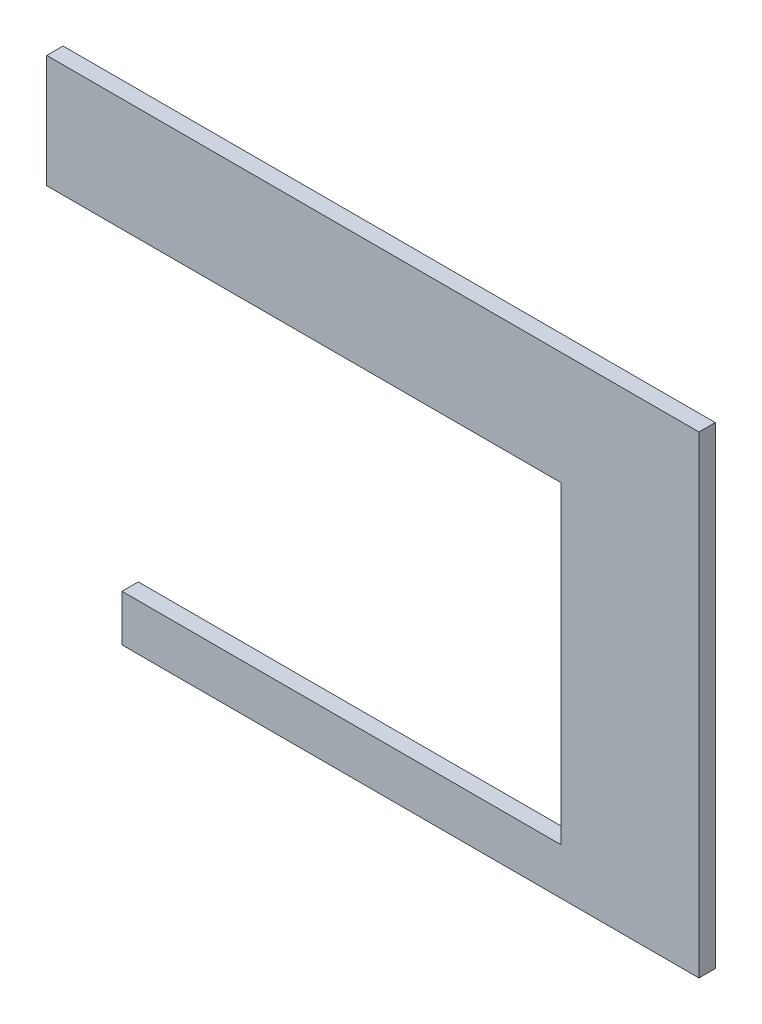
ISO-10303-21;
HEADER;
FILE_DESCRIPTION(('STEP AP214'),'2;1');
FILE_NAME('part.step','',(''),(''),'','','');
FILE_SCHEMA(('AUTOMOTIVE_DESIGN { 1 0 10303 214 1 1 1 1 }'));
ENDSEC;
DATA;
#1=APPLICATION_CONTEXT('core data for automotive mechanical design processes');
#2=APPLICATION_PROTOCOL_DEFINITION('international standard','automotive_design',2000,#1);
#3=PRODUCT_CONTEXT('',#1,'mechanical');
#4=PRODUCT('Part','Part','',(#3));
#5=PRODUCT_RELATED_PRODUCT_CATEGORY('part','',(#4));
#6=PRODUCT_DEFINITION_FORMATION('','',#4);
#7=PRODUCT_DEFINITION_CONTEXT('part definition',#1,'design');
#8=PRODUCT_DEFINITION('design','',#6,#7);
#9=PRODUCT_DEFINITION_SHAPE('','',#8);
#10=(LENGTH_UNIT() NAMED_UNIT(*) SI_UNIT(.MILLI.,.METRE.));
#11=(NAMED_UNIT(*) PLANE_ANGLE_UNIT() SI_UNIT($,.RADIAN.));
#12=(NAMED_UNIT(*) SI_UNIT($,.STERADIAN.) SOLID_ANGLE_UNIT());
#13=UNCERTAINTY_MEASURE_WITH_UNIT(LENGTH_MEASURE(1.E-05),#10,'distance_accuracy_value','');
#14=(GEOMETRIC_REPRESENTATION_CONTEXT(3) GLOBAL_UNCERTAINTY_ASSIGNED_CONTEXT((#13)) GLOBAL_UNIT_ASSIGNED_CONTEXT((#10,
#11,#12)) REPRESENTATION_CONTEXT('',''));
#15=CARTESIAN_POINT('',(0.,0.,0.));
#16=DIRECTION('',(0.,0.,1.));
#17=DIRECTION('',(1.,0.,0.));
#18=AXIS2_PLACEMENT_3D('',#15,#16,#17);
#19=CARTESIAN_POINT('',(9.23076923076924,-15.,0.5));
#20=DIRECTION('',(-1.,0.,0.));
#21=DIRECTION('',(0.,0.,1.));
#22=AXIS2_PLACEMENT_3D('',#19,#20,#21);
#23=PLANE('',#22);
#24=DIRECTION('',(0.,1.,0.));
#25=VECTOR('',#24,1.);
#26=CARTESIAN_POINT('',(9.23076923076924,-15.,0.5));
#27=LINE('',#26,#25);
#28=CARTESIAN_POINT('',(9.23076923076924,0.5,0.5));
#29=VERTEX_POINT('',#28);
#30=CARTESIAN_POINT('',(9.23076923076924,15.,0.5));
#31=VERTEX_POINT('',#30);
#32=EDGE_CURVE('E120',#29,#31,#27,.T.);
#33=ORIENTED_EDGE('',*,*,#32,.F.);
#34=DIRECTION('',(0.,0.,-1.));
#35=VECTOR('',#34,1.);
#36=CARTESIAN_POINT('',(9.23076923076924,0.5,0.5));
#37=LINE('',#36,#35);
#38=CARTESIAN_POINT('',(9.23076923076924,0.5,0.));
#39=VERTEX_POINT('',#38);
#40=EDGE_CURVE('E53',#29,#39,#37,.T.);
#41=ORIENTED_EDGE('',*,*,#40,.T.);
#42=DIRECTION('',(0.,1.,0.));
#43=VECTOR('',#42,1.);
#44=CARTESIAN_POINT('',(9.23076923076924,-15.,0.));
#45=LINE('',#44,#43);
#46=CARTESIAN_POINT('',(9.23076923076924,15.,0.));
#47=VERTEX_POINT('',#46);
#48=EDGE_CURVE('E115',#39,#47,#45,.T.);
#49=ORIENTED_EDGE('',*,*,#48,.T.);
#50=DIRECTION('',(0.,0.,-1.));
#51=VECTOR('',#50,1.);
#52=CARTESIAN_POINT('',(9.23076923076924,15.,0.5));
#53=LINE('',#52,#51);
#54=EDGE_CURVE('E140',#31,#47,#53,.T.);
#55=ORIENTED_EDGE('',*,*,#54,.F.);
#56=EDGE_LOOP('',(#33,#41,#49,#55));
#57=FACE_BOUND('',#56,.T.);
#58=ADVANCED_FACE('F39',(#57),#23,.F.);
#59=CARTESIAN_POINT('',(-8.46153846153845,1.92307692307692,0.5));
#60=DIRECTION('',(1.,0.,0.));
#61=DIRECTION('',(0.,0.,-1.));
#62=AXIS2_PLACEMENT_3D('',#59,#60,#61);
#63=PLANE('',#62);
#64=DIRECTION('',(0.,-1.,0.));
#65=VECTOR('',#64,1.);
#66=CARTESIAN_POINT('',(-8.46153846153845,1.92307692307692,0.));
#67=LINE('',#66,#65);
#68=CARTESIAN_POINT('',(-8.46153846153845,1.92307692307692,0.));
#69=VERTEX_POINT('',#68);
#70=CARTESIAN_POINT('',(-8.46153846153845,0.5,0.));
#71=VERTEX_POINT('',#70);
#72=EDGE_CURVE('E103',#69,#71,#67,.T.);
#73=ORIENTED_EDGE('',*,*,#72,.T.);
#74=DIRECTION('',(0.,0.,1.));
#75=VECTOR('',#74,1.);
#76=CARTESIAN_POINT('',(-8.46153846153845,0.5,0.5));
#77=LINE('',#76,#75);
#78=CARTESIAN_POINT('',(-8.46153846153845,0.5,0.5));
#79=VERTEX_POINT('',#78);
#80=EDGE_CURVE('E100',#71,#79,#77,.T.);
#81=ORIENTED_EDGE('',*,*,#80,.T.);
#82=DIRECTION('',(0.,-1.,0.));
#83=VECTOR('',#82,1.);
#84=CARTESIAN_POINT('',(-8.46153846153845,1.92307692307692,0.5));
#85=LINE('',#84,#83);
#86=CARTESIAN_POINT('',(-8.46153846153845,1.92307692307692,0.5));
#87=VERTEX_POINT('',#86);
#88=EDGE_CURVE('E123',#87,#79,#85,.T.);
#89=ORIENTED_EDGE('',*,*,#88,.F.);
#90=DIRECTION('',(0.,0.,-1.));
#91=VECTOR('',#90,1.);
#92=CARTESIAN_POINT('',(-8.46153846153845,1.92307692307692,0.5));
#93=LINE('',#92,#91);
#94=EDGE_CURVE('E101',#87,#69,#93,.T.);
#95=ORIENTED_EDGE('',*,*,#94,.T.);
#96=EDGE_LOOP('',(#73,#81,#89,#95));
#97=FACE_BOUND('',#96,.T.);
#98=ADVANCED_FACE('F114',(#97),#63,.F.);
#99=CARTESIAN_POINT('',(0.,0.,0.5));
#100=DIRECTION('',(0.,0.,1.));
#101=DIRECTION('',(1.,0.,0.));
#102=AXIS2_PLACEMENT_3D('',#99,#100,#101);
#103=PLANE('',#102);
#104=DIRECTION('',(-1.,0.,0.));
#105=VECTOR('',#104,1.);
#106=CARTESIAN_POINT('',(0.,0.5,0.5));
#107=LINE('',#106,#105);
#108=EDGE_CURVE('E48',#29,#79,#107,.T.);
#109=ORIENTED_EDGE('',*,*,#108,.F.);
#110=ORIENTED_EDGE('',*,*,#32,.T.);
#111=DIRECTION('',(-1.,0.,0.));
#112=VECTOR('',#111,1.);
#113=CARTESIAN_POINT('',(9.23076923076924,15.,0.5));
#114=LINE('',#113,#112);
#115=CARTESIAN_POINT('',(-10.7692307692308,15.,0.5));
#116=VERTEX_POINT('',#115);
#117=EDGE_CURVE('E118',#31,#116,#114,.T.);
#118=ORIENTED_EDGE('',*,*,#117,.T.);
#119=DIRECTION('',(0.,-1.,0.));
#120=VECTOR('',#119,1.);
#121=CARTESIAN_POINT('',(-10.7692307692308,15.,0.5));
#122=LINE('',#121,#120);
#123=CARTESIAN_POINT('',(-10.7692307692308,11.5384615384615,0.5));
#124=VERTEX_POINT('',#123);
#125=EDGE_CURVE('E129',#116,#124,#122,.T.);
#126=ORIENTED_EDGE('',*,*,#125,.T.);
#127=DIRECTION('',(1.,0.,0.));
#128=VECTOR('',#127,1.);
#129=CARTESIAN_POINT('',(-10.7692307692308,11.5384615384615,0.5));
#130=LINE('',#129,#128);
#131=CARTESIAN_POINT('',(5.00000000000001,11.5384615384615,0.5));
#132=VERTEX_POINT('',#131);
#133=EDGE_CURVE('E131',#124,#132,#130,.T.);
#134=ORIENTED_EDGE('',*,*,#133,.T.);
#135=DIRECTION('',(0.,-1.,0.));
#136=VECTOR('',#135,1.);
#137=CARTESIAN_POINT('',(5.00000000000001,11.5384615384615,0.5));
#138=LINE('',#137,#136);
#139=CARTESIAN_POINT('',(5.00000000000001,1.92307692307692,0.5));
#140=VERTEX_POINT('',#139);
#141=EDGE_CURVE('E133',#132,#140,#138,.T.);
#142=ORIENTED_EDGE('',*,*,#141,.T.);
#143=DIRECTION('',(-1.,0.,0.));
#144=VECTOR('',#143,1.);
#145=CARTESIAN_POINT('',(5.00000000000001,1.92307692307692,0.5));
#146=LINE('',#145,#144);
#147=EDGE_CURVE('E125',#140,#87,#146,.T.);
#148=ORIENTED_EDGE('',*,*,#147,.T.);
#149=ORIENTED_EDGE('',*,*,#88,.T.);
#150=EDGE_LOOP('',(#109,#110,#118,#126,#134,#142,#148,#149));
#151=FACE_BOUND('',#150,.T.);
#152=ADVANCED_FACE('F177',(#151),#103,.T.);
#153=CARTESIAN_POINT('',(0.,0.,0.));
#154=DIRECTION('',(0.,0.,1.));
#155=DIRECTION('',(1.,0.,0.));
#156=AXIS2_PLACEMENT_3D('',#153,#154,#155);
#157=PLANE('',#156);
#158=DIRECTION('',(1.,0.,0.));
#159=VECTOR('',#158,1.);
#160=CARTESIAN_POINT('',(-17.,0.5,0.));
#161=LINE('',#160,#159);
#162=EDGE_CURVE('E11',#71,#39,#161,.T.);
#163=ORIENTED_EDGE('',*,*,#162,.F.);
#164=ORIENTED_EDGE('',*,*,#72,.F.);
#165=DIRECTION('',(-1.,0.,0.));
#166=VECTOR('',#165,1.);
#167=CARTESIAN_POINT('',(5.00000000000001,1.92307692307692,0.));
#168=LINE('',#167,#166);
#169=CARTESIAN_POINT('',(5.00000000000001,1.92307692307692,0.));
#170=VERTEX_POINT('',#169);
#171=EDGE_CURVE('E150',#170,#69,#168,.T.);
#172=ORIENTED_EDGE('',*,*,#171,.F.);
#173=DIRECTION('',(0.,-1.,0.));
#174=VECTOR('',#173,1.);
#175=CARTESIAN_POINT('',(5.00000000000001,11.5384615384615,0.));
#176=LINE('',#175,#174);
#177=CARTESIAN_POINT('',(5.00000000000001,11.5384615384615,0.));
#178=VERTEX_POINT('',#177);
#179=EDGE_CURVE('E143',#178,#170,#176,.T.);
#180=ORIENTED_EDGE('',*,*,#179,.F.);
#181=DIRECTION('',(1.,0.,0.));
#182=VECTOR('',#181,1.);
#183=CARTESIAN_POINT('',(-10.7692307692308,11.5384615384615,0.));
#184=LINE('',#183,#182);
#185=CARTESIAN_POINT('',(-10.7692307692308,11.5384615384615,0.));
#186=VERTEX_POINT('',#185);
#187=EDGE_CURVE('E141',#186,#178,#184,.T.);
#188=ORIENTED_EDGE('',*,*,#187,.F.);
#189=DIRECTION('',(0.,-1.,0.));
#190=VECTOR('',#189,1.);
#191=CARTESIAN_POINT('',(-10.7692307692308,15.,0.));
#192=LINE('',#191,#190);
#193=CARTESIAN_POINT('',(-10.7692307692308,15.,0.));
#194=VERTEX_POINT('',#193);
#195=EDGE_CURVE('E138',#194,#186,#192,.T.);
#196=ORIENTED_EDGE('',*,*,#195,.F.);
#197=DIRECTION('',(-1.,0.,0.));
#198=VECTOR('',#197,1.);
#199=CARTESIAN_POINT('',(9.23076923076924,15.,0.));
#200=LINE('',#199,#198);
#201=EDGE_CURVE('E121',#47,#194,#200,.T.);
#202=ORIENTED_EDGE('',*,*,#201,.F.);
#203=ORIENTED_EDGE('',*,*,#48,.F.);
#204=EDGE_LOOP('',(#163,#164,#172,#180,#188,#196,#202,#203));
#205=FACE_BOUND('',#204,.T.);
#206=ADVANCED_FACE('F41',(#205),#157,.F.);
#207=CARTESIAN_POINT('',(9.23076923076924,15.,0.5));
#208=DIRECTION('',(0.,-1.,0.));
#209=DIRECTION('',(0.,0.,-1.));
#210=AXIS2_PLACEMENT_3D('',#207,#208,#209);
#211=PLANE('',#210);
#212=ORIENTED_EDGE('',*,*,#201,.T.);
#213=DIRECTION('',(0.,0.,-1.));
#214=VECTOR('',#213,1.);
#215=CARTESIAN_POINT('',(-10.7692307692308,15.,0.5));
#216=LINE('',#215,#214);
#217=EDGE_CURVE('E139',#116,#194,#216,.T.);
#218=ORIENTED_EDGE('',*,*,#217,.F.);
#219=ORIENTED_EDGE('',*,*,#117,.F.);
#220=ORIENTED_EDGE('',*,*,#54,.T.);
#221=EDGE_LOOP('',(#212,#218,#219,#220));
#222=FACE_BOUND('',#221,.T.);
#223=ADVANCED_FACE('F164',(#222),#211,.F.);
#224=CARTESIAN_POINT('',(-10.7692307692308,15.,0.5));
#225=DIRECTION('',(1.,0.,0.));
#226=DIRECTION('',(0.,0.,-1.));
#227=AXIS2_PLACEMENT_3D('',#224,#225,#226);
#228=PLANE('',#227);
#229=ORIENTED_EDGE('',*,*,#195,.T.);
#230=DIRECTION('',(0.,0.,-1.));
#231=VECTOR('',#230,1.);
#232=CARTESIAN_POINT('',(-10.7692307692308,11.5384615384615,0.5));
#233=LINE('',#232,#231);
#234=EDGE_CURVE('E142',#124,#186,#233,.T.);
#235=ORIENTED_EDGE('',*,*,#234,.F.);
#236=ORIENTED_EDGE('',*,*,#125,.F.);
#237=ORIENTED_EDGE('',*,*,#217,.T.);
#238=EDGE_LOOP('',(#229,#235,#236,#237));
#239=FACE_BOUND('',#238,.T.);
#240=ADVANCED_FACE('F173',(#239),#228,.F.);
#241=CARTESIAN_POINT('',(-10.7692307692308,11.5384615384615,0.5));
#242=DIRECTION('',(0.,1.,0.));
#243=DIRECTION('',(0.,0.,1.));
#244=AXIS2_PLACEMENT_3D('',#241,#242,#243);
#245=PLANE('',#244);
#246=ORIENTED_EDGE('',*,*,#187,.T.);
#247=DIRECTION('',(0.,0.,-1.));
#248=VECTOR('',#247,1.);
#249=CARTESIAN_POINT('',(5.00000000000001,11.5384615384615,0.5));
#250=LINE('',#249,#248);
#251=EDGE_CURVE('E147',#132,#178,#250,.T.);
#252=ORIENTED_EDGE('',*,*,#251,.F.);
#253=ORIENTED_EDGE('',*,*,#133,.F.);
#254=ORIENTED_EDGE('',*,*,#234,.T.);
#255=EDGE_LOOP('',(#246,#252,#253,#254));
#256=FACE_BOUND('',#255,.T.);
#257=ADVANCED_FACE('F172',(#256),#245,.F.);
#258=CARTESIAN_POINT('',(5.00000000000001,11.5384615384615,0.5));
#259=DIRECTION('',(1.,0.,0.));
#260=DIRECTION('',(0.,0.,-1.));
#261=AXIS2_PLACEMENT_3D('',#258,#259,#260);
#262=PLANE('',#261);
#263=ORIENTED_EDGE('',*,*,#179,.T.);
#264=DIRECTION('',(0.,0.,-1.));
#265=VECTOR('',#264,1.);
#266=CARTESIAN_POINT('',(5.00000000000001,1.92307692307692,0.5));
#267=LINE('',#266,#265);
#268=EDGE_CURVE('E124',#140,#170,#267,.T.);
#269=ORIENTED_EDGE('',*,*,#268,.F.);
#270=ORIENTED_EDGE('',*,*,#141,.F.);
#271=ORIENTED_EDGE('',*,*,#251,.T.);
#272=EDGE_LOOP('',(#263,#269,#270,#271));
#273=FACE_BOUND('',#272,.T.);
#274=ADVANCED_FACE('F193',(#273),#262,.F.);
#275=CARTESIAN_POINT('',(5.00000000000001,1.92307692307692,0.5));
#276=DIRECTION('',(0.,-1.,0.));
#277=DIRECTION('',(0.,0.,-1.));
#278=AXIS2_PLACEMENT_3D('',#275,#276,#277);
#279=PLANE('',#278);
#280=ORIENTED_EDGE('',*,*,#171,.T.);
#281=ORIENTED_EDGE('',*,*,#94,.F.);
#282=ORIENTED_EDGE('',*,*,#147,.F.);
#283=ORIENTED_EDGE('',*,*,#268,.T.);
#284=EDGE_LOOP('',(#280,#281,#282,#283));
#285=FACE_BOUND('',#284,.T.);
#286=ADVANCED_FACE('F195',(#285),#279,.F.);
#287=CARTESIAN_POINT('',(-17.,0.5,1.));
#288=DIRECTION('',(0.,1.,0.));
#289=DIRECTION('',(0.,0.,1.));
#290=AXIS2_PLACEMENT_3D('',#287,#288,#289);
#291=PLANE('',#290);
#292=ORIENTED_EDGE('',*,*,#108,.T.);
#293=ORIENTED_EDGE('',*,*,#80,.F.);
#294=ORIENTED_EDGE('',*,*,#162,.T.);
#295=ORIENTED_EDGE('',*,*,#40,.F.);
#296=EDGE_LOOP('',(#292,#293,#294,#295));
#297=FACE_BOUND('',#296,.T.);
#298=ADVANCED_FACE('F98',(#297),#291,.F.);
#299=CLOSED_SHELL('',(#58,#98,#152,#206,#223,#240,#257,#274,#286,#298));
#300=MANIFOLD_SOLID_BREP('B2',#299);
#301=ADVANCED_BREP_SHAPE_REPRESENTATION('',(#18,#300),#14);
#302=SHAPE_DEFINITION_REPRESENTATION(#9,#301);
ENDSEC;
END-ISO-10303-21;
